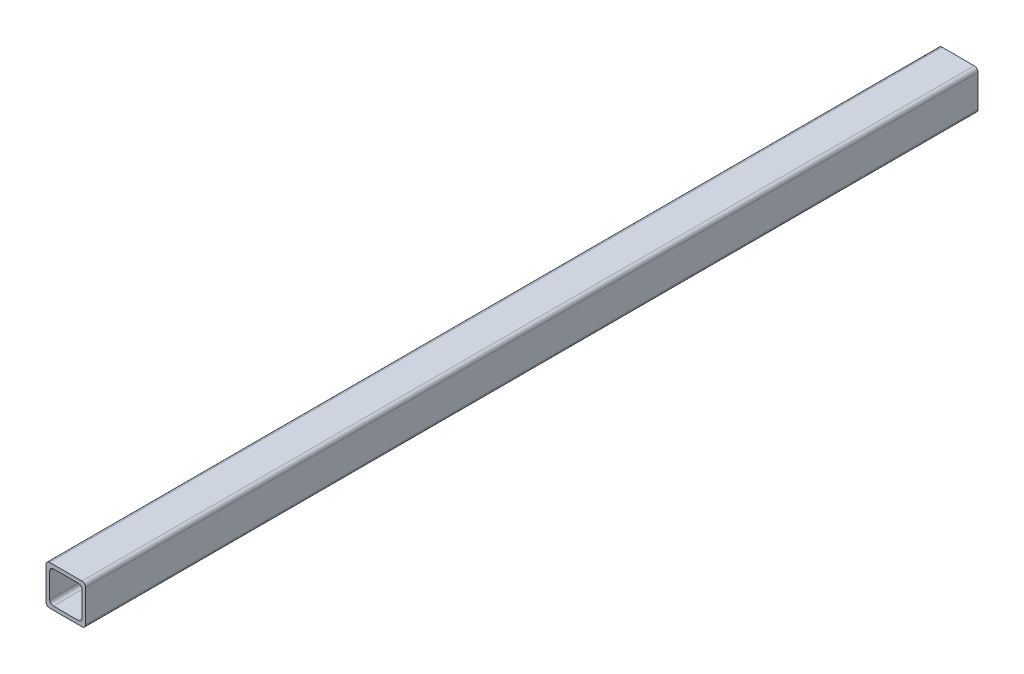
ISO-10303-21;
HEADER;
FILE_DESCRIPTION(('STEP AP214'),'2;1');
FILE_NAME('part.step','',(''),(''),'','','');
FILE_SCHEMA(('AUTOMOTIVE_DESIGN { 1 0 10303 214 1 1 1 1 }'));
ENDSEC;
DATA;
#1=APPLICATION_CONTEXT('core data for automotive mechanical design processes');
#2=APPLICATION_PROTOCOL_DEFINITION('international standard','automotive_design',2000,#1);
#3=PRODUCT_CONTEXT('',#1,'mechanical');
#4=PRODUCT('Part','Part','',(#3));
#5=PRODUCT_RELATED_PRODUCT_CATEGORY('part','',(#4));
#6=PRODUCT_DEFINITION_FORMATION('','',#4);
#7=PRODUCT_DEFINITION_CONTEXT('part definition',#1,'design');
#8=PRODUCT_DEFINITION('design','',#6,#7);
#9=PRODUCT_DEFINITION_SHAPE('','',#8);
#10=(LENGTH_UNIT() NAMED_UNIT(*) SI_UNIT(.MILLI.,.METRE.));
#11=(NAMED_UNIT(*) PLANE_ANGLE_UNIT() SI_UNIT($,.RADIAN.));
#12=(NAMED_UNIT(*) SI_UNIT($,.STERADIAN.) SOLID_ANGLE_UNIT());
#13=UNCERTAINTY_MEASURE_WITH_UNIT(LENGTH_MEASURE(1.E-05),#10,'distance_accuracy_value','');
#14=(GEOMETRIC_REPRESENTATION_CONTEXT(3) GLOBAL_UNCERTAINTY_ASSIGNED_CONTEXT((#13)) GLOBAL_UNIT_ASSIGNED_CONTEXT((#10,
#11,#12)) REPRESENTATION_CONTEXT('',''));
#15=CARTESIAN_POINT('',(0.,0.,0.));
#16=DIRECTION('',(0.,0.,1.));
#17=DIRECTION('',(1.,0.,0.));
#18=AXIS2_PLACEMENT_3D('',#15,#16,#17);
#19=CARTESIAN_POINT('',(11.,11.,609.6));
#20=DIRECTION('',(0.,0.,-1.));
#21=DIRECTION('',(-1.,0.,0.));
#22=AXIS2_PLACEMENT_3D('',#19,#20,#21);
#23=PLANE('',#22);
#24=CARTESIAN_POINT('',(11.,11.,609.6));
#25=DIRECTION('',(0.,0.,1.));
#26=DIRECTION('',(-1.,0.,0.));
#27=AXIS2_PLACEMENT_3D('',#24,#25,#26);
#28=CIRCLE('',#27,2.54);
#29=CARTESIAN_POINT('',(13.54,11.,609.6));
#30=VERTEX_POINT('',#29);
#31=CARTESIAN_POINT('',(11.,13.54,609.6));
#32=VERTEX_POINT('',#31);
#33=EDGE_CURVE('E248',#30,#32,#28,.T.);
#34=ORIENTED_EDGE('',*,*,#33,.T.);
#35=DIRECTION('',(-1.,0.,0.));
#36=VECTOR('',#35,1.);
#37=CARTESIAN_POINT('',(-11.,13.54,609.6));
#38=LINE('',#37,#36);
#39=CARTESIAN_POINT('',(-11.,13.54,609.6));
#40=VERTEX_POINT('',#39);
#41=EDGE_CURVE('E252',#32,#40,#38,.T.);
#42=ORIENTED_EDGE('',*,*,#41,.T.);
#43=CARTESIAN_POINT('',(-11.,11.,609.6));
#44=DIRECTION('',(0.,0.,1.));
#45=DIRECTION('',(-1.,0.,0.));
#46=AXIS2_PLACEMENT_3D('',#43,#44,#45);
#47=CIRCLE('',#46,2.54);
#48=CARTESIAN_POINT('',(-13.54,11.,609.6));
#49=VERTEX_POINT('',#48);
#50=EDGE_CURVE('E256',#40,#49,#47,.T.);
#51=ORIENTED_EDGE('',*,*,#50,.T.);
#52=DIRECTION('',(0.,-1.,0.));
#53=VECTOR('',#52,1.);
#54=CARTESIAN_POINT('',(-13.54,-11.,609.6));
#55=LINE('',#54,#53);
#56=CARTESIAN_POINT('',(-13.54,-11.,609.6));
#57=VERTEX_POINT('',#56);
#58=EDGE_CURVE('E259',#49,#57,#55,.T.);
#59=ORIENTED_EDGE('',*,*,#58,.T.);
#60=CARTESIAN_POINT('',(-11.,-11.,609.6));
#61=DIRECTION('',(0.,0.,1.));
#62=DIRECTION('',(-1.,0.,0.));
#63=AXIS2_PLACEMENT_3D('',#60,#61,#62);
#64=CIRCLE('',#63,2.54);
#65=CARTESIAN_POINT('',(-11.,-13.54,609.6));
#66=VERTEX_POINT('',#65);
#67=EDGE_CURVE('E262',#57,#66,#64,.T.);
#68=ORIENTED_EDGE('',*,*,#67,.T.);
#69=DIRECTION('',(1.,0.,0.));
#70=VECTOR('',#69,1.);
#71=CARTESIAN_POINT('',(-11.,-13.54,609.6));
#72=LINE('',#71,#70);
#73=CARTESIAN_POINT('',(11.,-13.54,609.6));
#74=VERTEX_POINT('',#73);
#75=EDGE_CURVE('E265',#66,#74,#72,.T.);
#76=ORIENTED_EDGE('',*,*,#75,.T.);
#77=CARTESIAN_POINT('',(11.,-11.,609.6));
#78=DIRECTION('',(0.,0.,1.));
#79=DIRECTION('',(1.,0.,0.));
#80=AXIS2_PLACEMENT_3D('',#77,#78,#79);
#81=CIRCLE('',#80,2.54);
#82=CARTESIAN_POINT('',(13.54,-11.,609.6));
#83=VERTEX_POINT('',#82);
#84=EDGE_CURVE('E268',#74,#83,#81,.T.);
#85=ORIENTED_EDGE('',*,*,#84,.T.);
#86=DIRECTION('',(0.,1.,0.));
#87=VECTOR('',#86,1.);
#88=CARTESIAN_POINT('',(13.54,-11.,609.6));
#89=LINE('',#88,#87);
#90=EDGE_CURVE('E271',#83,#30,#89,.T.);
#91=ORIENTED_EDGE('',*,*,#90,.T.);
#92=EDGE_LOOP('',(#34,#42,#51,#59,#68,#76,#85,#91));
#93=FACE_BOUND('',#92,.T.);
#94=CARTESIAN_POINT('',(8.46,-8.46,609.6));
#95=DIRECTION('',(0.,0.,1.));
#96=DIRECTION('',(-1.,0.,0.));
#97=AXIS2_PLACEMENT_3D('',#94,#95,#96);
#98=CIRCLE('',#97,2.54);
#99=CARTESIAN_POINT('',(8.45999999999998,-11.,609.6));
#100=VERTEX_POINT('',#99);
#101=CARTESIAN_POINT('',(11.,-8.45999999999998,609.6));
#102=VERTEX_POINT('',#101);
#103=EDGE_CURVE('E159',#100,#102,#98,.T.);
#104=ORIENTED_EDGE('',*,*,#103,.F.);
#105=DIRECTION('',(1.,0.,0.));
#106=VECTOR('',#105,1.);
#107=CARTESIAN_POINT('',(-8.45999999999998,-11.,609.6));
#108=LINE('',#107,#106);
#109=CARTESIAN_POINT('',(-8.45999999999998,-11.,609.6));
#110=VERTEX_POINT('',#109);
#111=EDGE_CURVE('E200',#110,#100,#108,.T.);
#112=ORIENTED_EDGE('',*,*,#111,.F.);
#113=CARTESIAN_POINT('',(-8.46,-8.46,609.6));
#114=DIRECTION('',(0.,0.,1.));
#115=DIRECTION('',(1.,0.,0.));
#116=AXIS2_PLACEMENT_3D('',#113,#114,#115);
#117=CIRCLE('',#116,2.54);
#118=CARTESIAN_POINT('',(-11.,-8.45999999999998,609.6));
#119=VERTEX_POINT('',#118);
#120=EDGE_CURVE('E197',#119,#110,#117,.T.);
#121=ORIENTED_EDGE('',*,*,#120,.F.);
#122=DIRECTION('',(0.,-1.,0.));
#123=VECTOR('',#122,1.);
#124=CARTESIAN_POINT('',(-11.,-8.45999999999998,609.6));
#125=LINE('',#124,#123);
#126=CARTESIAN_POINT('',(-11.,8.45999999999998,609.6));
#127=VERTEX_POINT('',#126);
#128=EDGE_CURVE('E194',#127,#119,#125,.T.);
#129=ORIENTED_EDGE('',*,*,#128,.F.);
#130=CARTESIAN_POINT('',(-8.46,8.46,609.6));
#131=DIRECTION('',(0.,0.,1.));
#132=DIRECTION('',(-1.,0.,0.));
#133=AXIS2_PLACEMENT_3D('',#130,#131,#132);
#134=CIRCLE('',#133,2.54);
#135=CARTESIAN_POINT('',(-8.45999999999998,11.,609.6));
#136=VERTEX_POINT('',#135);
#137=EDGE_CURVE('E191',#136,#127,#134,.T.);
#138=ORIENTED_EDGE('',*,*,#137,.F.);
#139=DIRECTION('',(-1.,0.,0.));
#140=VECTOR('',#139,1.);
#141=CARTESIAN_POINT('',(-8.45999999999998,11.,609.6));
#142=LINE('',#141,#140);
#143=CARTESIAN_POINT('',(8.45999999999998,11.,609.6));
#144=VERTEX_POINT('',#143);
#145=EDGE_CURVE('E186',#144,#136,#142,.T.);
#146=ORIENTED_EDGE('',*,*,#145,.F.);
#147=CARTESIAN_POINT('',(8.46,8.46,609.6));
#148=DIRECTION('',(0.,0.,1.));
#149=DIRECTION('',(-1.,0.,0.));
#150=AXIS2_PLACEMENT_3D('',#147,#148,#149);
#151=CIRCLE('',#150,2.54);
#152=CARTESIAN_POINT('',(11.,8.45999999999998,609.6));
#153=VERTEX_POINT('',#152);
#154=EDGE_CURVE('E182',#153,#144,#151,.T.);
#155=ORIENTED_EDGE('',*,*,#154,.F.);
#156=DIRECTION('',(0.,1.,0.));
#157=VECTOR('',#156,1.);
#158=CARTESIAN_POINT('',(11.,-8.45999999999998,609.6));
#159=LINE('',#158,#157);
#160=EDGE_CURVE('E168',#102,#153,#159,.T.);
#161=ORIENTED_EDGE('',*,*,#160,.F.);
#162=EDGE_LOOP('',(#104,#112,#121,#129,#138,#146,#155,#161));
#163=FACE_BOUND('',#162,.T.);
#164=ADVANCED_FACE('F45',(#93,#163),#23,.F.);
#165=CARTESIAN_POINT('',(11.,11.,0.));
#166=DIRECTION('',(0.,0.,-1.));
#167=DIRECTION('',(-1.,0.,0.));
#168=AXIS2_PLACEMENT_3D('',#165,#166,#167);
#169=PLANE('',#168);
#170=CARTESIAN_POINT('',(11.,11.,0.));
#171=DIRECTION('',(0.,0.,1.));
#172=DIRECTION('',(-1.,0.,0.));
#173=AXIS2_PLACEMENT_3D('',#170,#171,#172);
#174=CIRCLE('',#173,2.54);
#175=CARTESIAN_POINT('',(13.54,11.,0.));
#176=VERTEX_POINT('',#175);
#177=CARTESIAN_POINT('',(11.,13.54,0.));
#178=VERTEX_POINT('',#177);
#179=EDGE_CURVE('E177',#176,#178,#174,.T.);
#180=ORIENTED_EDGE('',*,*,#179,.F.);
#181=DIRECTION('',(0.,1.,0.));
#182=VECTOR('',#181,1.);
#183=CARTESIAN_POINT('',(13.54,-11.,0.));
#184=LINE('',#183,#182);
#185=CARTESIAN_POINT('',(13.54,-11.,0.));
#186=VERTEX_POINT('',#185);
#187=EDGE_CURVE('E253',#186,#176,#184,.T.);
#188=ORIENTED_EDGE('',*,*,#187,.F.);
#189=CARTESIAN_POINT('',(11.,-11.,0.));
#190=DIRECTION('',(0.,0.,1.));
#191=DIRECTION('',(1.,0.,0.));
#192=AXIS2_PLACEMENT_3D('',#189,#190,#191);
#193=CIRCLE('',#192,2.54);
#194=CARTESIAN_POINT('',(11.,-13.54,0.));
#195=VERTEX_POINT('',#194);
#196=EDGE_CURVE('E293',#195,#186,#193,.T.);
#197=ORIENTED_EDGE('',*,*,#196,.F.);
#198=DIRECTION('',(1.,0.,0.));
#199=VECTOR('',#198,1.);
#200=CARTESIAN_POINT('',(-11.,-13.54,0.));
#201=LINE('',#200,#199);
#202=CARTESIAN_POINT('',(-11.,-13.54,0.));
#203=VERTEX_POINT('',#202);
#204=EDGE_CURVE('E290',#203,#195,#201,.T.);
#205=ORIENTED_EDGE('',*,*,#204,.F.);
#206=CARTESIAN_POINT('',(-11.,-11.,0.));
#207=DIRECTION('',(0.,0.,1.));
#208=DIRECTION('',(-1.,0.,0.));
#209=AXIS2_PLACEMENT_3D('',#206,#207,#208);
#210=CIRCLE('',#209,2.54);
#211=CARTESIAN_POINT('',(-13.54,-11.,0.));
#212=VERTEX_POINT('',#211);
#213=EDGE_CURVE('E287',#212,#203,#210,.T.);
#214=ORIENTED_EDGE('',*,*,#213,.F.);
#215=DIRECTION('',(0.,-1.,0.));
#216=VECTOR('',#215,1.);
#217=CARTESIAN_POINT('',(-13.54,-11.,0.));
#218=LINE('',#217,#216);
#219=CARTESIAN_POINT('',(-13.54,11.,0.));
#220=VERTEX_POINT('',#219);
#221=EDGE_CURVE('E284',#220,#212,#218,.T.);
#222=ORIENTED_EDGE('',*,*,#221,.F.);
#223=CARTESIAN_POINT('',(-11.,11.,0.));
#224=DIRECTION('',(0.,0.,1.));
#225=DIRECTION('',(-1.,0.,0.));
#226=AXIS2_PLACEMENT_3D('',#223,#224,#225);
#227=CIRCLE('',#226,2.54);
#228=CARTESIAN_POINT('',(-11.,13.54,0.));
#229=VERTEX_POINT('',#228);
#230=EDGE_CURVE('E281',#229,#220,#227,.T.);
#231=ORIENTED_EDGE('',*,*,#230,.F.);
#232=DIRECTION('',(-1.,0.,0.));
#233=VECTOR('',#232,1.);
#234=CARTESIAN_POINT('',(-11.,13.54,0.));
#235=LINE('',#234,#233);
#236=EDGE_CURVE('E278',#178,#229,#235,.T.);
#237=ORIENTED_EDGE('',*,*,#236,.F.);
#238=EDGE_LOOP('',(#180,#188,#197,#205,#214,#222,#231,#237));
#239=FACE_BOUND('',#238,.T.);
#240=DIRECTION('',(1.,0.,0.));
#241=VECTOR('',#240,1.);
#242=CARTESIAN_POINT('',(-8.45999999999998,-11.,0.));
#243=LINE('',#242,#241);
#244=CARTESIAN_POINT('',(-8.45999999999998,-11.,0.));
#245=VERTEX_POINT('',#244);
#246=CARTESIAN_POINT('',(8.45999999999998,-11.,0.));
#247=VERTEX_POINT('',#246);
#248=EDGE_CURVE('E169',#245,#247,#243,.T.);
#249=ORIENTED_EDGE('',*,*,#248,.T.);
#250=CARTESIAN_POINT('',(8.46,-8.46,0.));
#251=DIRECTION('',(0.,0.,1.));
#252=DIRECTION('',(-1.,0.,0.));
#253=AXIS2_PLACEMENT_3D('',#250,#251,#252);
#254=CIRCLE('',#253,2.54);
#255=CARTESIAN_POINT('',(11.,-8.45999999999998,0.));
#256=VERTEX_POINT('',#255);
#257=EDGE_CURVE('E69',#247,#256,#254,.T.);
#258=ORIENTED_EDGE('',*,*,#257,.T.);
#259=DIRECTION('',(0.,1.,0.));
#260=VECTOR('',#259,1.);
#261=CARTESIAN_POINT('',(11.,-8.45999999999998,0.));
#262=LINE('',#261,#260);
#263=CARTESIAN_POINT('',(11.,8.45999999999998,0.));
#264=VERTEX_POINT('',#263);
#265=EDGE_CURVE('E175',#256,#264,#262,.T.);
#266=ORIENTED_EDGE('',*,*,#265,.T.);
#267=CARTESIAN_POINT('',(8.46,8.46,0.));
#268=DIRECTION('',(0.,0.,1.));
#269=DIRECTION('',(-1.,0.,0.));
#270=AXIS2_PLACEMENT_3D('',#267,#268,#269);
#271=CIRCLE('',#270,2.54);
#272=CARTESIAN_POINT('',(8.45999999999998,11.,0.));
#273=VERTEX_POINT('',#272);
#274=EDGE_CURVE('E207',#264,#273,#271,.T.);
#275=ORIENTED_EDGE('',*,*,#274,.T.);
#276=DIRECTION('',(-1.,0.,0.));
#277=VECTOR('',#276,1.);
#278=CARTESIAN_POINT('',(-8.45999999999998,11.,0.));
#279=LINE('',#278,#277);
#280=CARTESIAN_POINT('',(-8.45999999999998,11.,0.));
#281=VERTEX_POINT('',#280);
#282=EDGE_CURVE('E211',#273,#281,#279,.T.);
#283=ORIENTED_EDGE('',*,*,#282,.T.);
#284=CARTESIAN_POINT('',(-8.46,8.46,0.));
#285=DIRECTION('',(0.,0.,1.));
#286=DIRECTION('',(-1.,0.,0.));
#287=AXIS2_PLACEMENT_3D('',#284,#285,#286);
#288=CIRCLE('',#287,2.54);
#289=CARTESIAN_POINT('',(-11.,8.45999999999998,0.));
#290=VERTEX_POINT('',#289);
#291=EDGE_CURVE('E215',#281,#290,#288,.T.);
#292=ORIENTED_EDGE('',*,*,#291,.T.);
#293=DIRECTION('',(0.,-1.,0.));
#294=VECTOR('',#293,1.);
#295=CARTESIAN_POINT('',(-11.,-8.45999999999998,0.));
#296=LINE('',#295,#294);
#297=CARTESIAN_POINT('',(-11.,-8.45999999999998,0.));
#298=VERTEX_POINT('',#297);
#299=EDGE_CURVE('E219',#290,#298,#296,.T.);
#300=ORIENTED_EDGE('',*,*,#299,.T.);
#301=CARTESIAN_POINT('',(-8.46,-8.46,0.));
#302=DIRECTION('',(0.,0.,1.));
#303=DIRECTION('',(1.,0.,0.));
#304=AXIS2_PLACEMENT_3D('',#301,#302,#303);
#305=CIRCLE('',#304,2.54);
#306=EDGE_CURVE('E223',#298,#245,#305,.T.);
#307=ORIENTED_EDGE('',*,*,#306,.T.);
#308=EDGE_LOOP('',(#249,#258,#266,#275,#283,#292,#300,#307));
#309=FACE_BOUND('',#308,.T.);
#310=ADVANCED_FACE('F332',(#239,#309),#169,.T.);
#311=CARTESIAN_POINT('',(11.,11.,609.6));
#312=DIRECTION('',(0.,0.,-1.));
#313=DIRECTION('',(-1.,0.,0.));
#314=AXIS2_PLACEMENT_3D('',#311,#312,#313);
#315=CYLINDRICAL_SURFACE('',#314,2.54);
#316=ORIENTED_EDGE('',*,*,#179,.T.);
#317=DIRECTION('',(0.,0.,-1.));
#318=VECTOR('',#317,1.);
#319=CARTESIAN_POINT('',(11.,13.54,609.6));
#320=LINE('',#319,#318);
#321=EDGE_CURVE('E11',#32,#178,#320,.T.);
#322=ORIENTED_EDGE('',*,*,#321,.F.);
#323=ORIENTED_EDGE('',*,*,#33,.F.);
#324=DIRECTION('',(0.,0.,-1.));
#325=VECTOR('',#324,1.);
#326=CARTESIAN_POINT('',(13.54,11.,609.6));
#327=LINE('',#326,#325);
#328=EDGE_CURVE('E274',#30,#176,#327,.T.);
#329=ORIENTED_EDGE('',*,*,#328,.T.);
#330=EDGE_LOOP('',(#316,#322,#323,#329));
#331=FACE_BOUND('',#330,.T.);
#332=ADVANCED_FACE('F47',(#331),#315,.T.);
#333=CARTESIAN_POINT('',(-11.,13.54,609.6));
#334=DIRECTION('',(0.,-1.,0.));
#335=DIRECTION('',(0.,0.,-1.));
#336=AXIS2_PLACEMENT_3D('',#333,#334,#335);
#337=PLANE('',#336);
#338=ORIENTED_EDGE('',*,*,#236,.T.);
#339=DIRECTION('',(0.,0.,-1.));
#340=VECTOR('',#339,1.);
#341=CARTESIAN_POINT('',(-11.,13.54,609.6));
#342=LINE('',#341,#340);
#343=EDGE_CURVE('E54',#40,#229,#342,.T.);
#344=ORIENTED_EDGE('',*,*,#343,.F.);
#345=ORIENTED_EDGE('',*,*,#41,.F.);
#346=ORIENTED_EDGE('',*,*,#321,.T.);
#347=EDGE_LOOP('',(#338,#344,#345,#346));
#348=FACE_BOUND('',#347,.T.);
#349=ADVANCED_FACE('F349',(#348),#337,.F.);
#350=CARTESIAN_POINT('',(-11.,11.,609.6));
#351=DIRECTION('',(0.,0.,-1.));
#352=DIRECTION('',(-1.,0.,0.));
#353=AXIS2_PLACEMENT_3D('',#350,#351,#352);
#354=CYLINDRICAL_SURFACE('',#353,2.54);
#355=ORIENTED_EDGE('',*,*,#230,.T.);
#356=DIRECTION('',(0.,0.,-1.));
#357=VECTOR('',#356,1.);
#358=CARTESIAN_POINT('',(-13.54,11.,609.6));
#359=LINE('',#358,#357);
#360=EDGE_CURVE('E317',#49,#220,#359,.T.);
#361=ORIENTED_EDGE('',*,*,#360,.F.);
#362=ORIENTED_EDGE('',*,*,#50,.F.);
#363=ORIENTED_EDGE('',*,*,#343,.T.);
#364=EDGE_LOOP('',(#355,#361,#362,#363));
#365=FACE_BOUND('',#364,.T.);
#366=ADVANCED_FACE('F326',(#365),#354,.T.);
#367=CARTESIAN_POINT('',(-13.54,-11.,609.6));
#368=DIRECTION('',(1.,0.,0.));
#369=DIRECTION('',(0.,0.,-1.));
#370=AXIS2_PLACEMENT_3D('',#367,#368,#369);
#371=PLANE('',#370);
#372=ORIENTED_EDGE('',*,*,#221,.T.);
#373=DIRECTION('',(0.,0.,-1.));
#374=VECTOR('',#373,1.);
#375=CARTESIAN_POINT('',(-13.54,-11.,609.6));
#376=LINE('',#375,#374);
#377=EDGE_CURVE('E313',#57,#212,#376,.T.);
#378=ORIENTED_EDGE('',*,*,#377,.F.);
#379=ORIENTED_EDGE('',*,*,#58,.F.);
#380=ORIENTED_EDGE('',*,*,#360,.T.);
#381=EDGE_LOOP('',(#372,#378,#379,#380));
#382=FACE_BOUND('',#381,.T.);
#383=ADVANCED_FACE('F338',(#382),#371,.F.);
#384=CARTESIAN_POINT('',(-11.,-11.,609.6));
#385=DIRECTION('',(0.,0.,-1.));
#386=DIRECTION('',(-1.,0.,0.));
#387=AXIS2_PLACEMENT_3D('',#384,#385,#386);
#388=CYLINDRICAL_SURFACE('',#387,2.54);
#389=ORIENTED_EDGE('',*,*,#213,.T.);
#390=DIRECTION('',(0.,0.,-1.));
#391=VECTOR('',#390,1.);
#392=CARTESIAN_POINT('',(-11.,-13.54,609.6));
#393=LINE('',#392,#391);
#394=EDGE_CURVE('E309',#66,#203,#393,.T.);
#395=ORIENTED_EDGE('',*,*,#394,.F.);
#396=ORIENTED_EDGE('',*,*,#67,.F.);
#397=ORIENTED_EDGE('',*,*,#377,.T.);
#398=EDGE_LOOP('',(#389,#395,#396,#397));
#399=FACE_BOUND('',#398,.T.);
#400=ADVANCED_FACE('F342',(#399),#388,.T.);
#401=CARTESIAN_POINT('',(-11.,-13.54,609.6));
#402=DIRECTION('',(0.,1.,0.));
#403=DIRECTION('',(0.,0.,1.));
#404=AXIS2_PLACEMENT_3D('',#401,#402,#403);
#405=PLANE('',#404);
#406=ORIENTED_EDGE('',*,*,#204,.T.);
#407=DIRECTION('',(0.,0.,-1.));
#408=VECTOR('',#407,1.);
#409=CARTESIAN_POINT('',(11.,-13.54,609.6));
#410=LINE('',#409,#408);
#411=EDGE_CURVE('E305',#74,#195,#410,.T.);
#412=ORIENTED_EDGE('',*,*,#411,.F.);
#413=ORIENTED_EDGE('',*,*,#75,.F.);
#414=ORIENTED_EDGE('',*,*,#394,.T.);
#415=EDGE_LOOP('',(#406,#412,#413,#414));
#416=FACE_BOUND('',#415,.T.);
#417=ADVANCED_FACE('F362',(#416),#405,.F.);
#418=CARTESIAN_POINT('',(11.,-11.,609.6));
#419=DIRECTION('',(0.,0.,-1.));
#420=DIRECTION('',(-1.,0.,0.));
#421=AXIS2_PLACEMENT_3D('',#418,#419,#420);
#422=CYLINDRICAL_SURFACE('',#421,2.54);
#423=ORIENTED_EDGE('',*,*,#196,.T.);
#424=DIRECTION('',(0.,0.,-1.));
#425=VECTOR('',#424,1.);
#426=CARTESIAN_POINT('',(13.54,-11.,609.6));
#427=LINE('',#426,#425);
#428=EDGE_CURVE('E301',#83,#186,#427,.T.);
#429=ORIENTED_EDGE('',*,*,#428,.F.);
#430=ORIENTED_EDGE('',*,*,#84,.F.);
#431=ORIENTED_EDGE('',*,*,#411,.T.);
#432=EDGE_LOOP('',(#423,#429,#430,#431));
#433=FACE_BOUND('',#432,.T.);
#434=ADVANCED_FACE('F360',(#433),#422,.T.);
#435=CARTESIAN_POINT('',(13.54,-11.,609.6));
#436=DIRECTION('',(-1.,0.,0.));
#437=DIRECTION('',(0.,0.,1.));
#438=AXIS2_PLACEMENT_3D('',#435,#436,#437);
#439=PLANE('',#438);
#440=ORIENTED_EDGE('',*,*,#187,.T.);
#441=ORIENTED_EDGE('',*,*,#328,.F.);
#442=ORIENTED_EDGE('',*,*,#90,.F.);
#443=ORIENTED_EDGE('',*,*,#428,.T.);
#444=EDGE_LOOP('',(#440,#441,#442,#443));
#445=FACE_BOUND('',#444,.T.);
#446=ADVANCED_FACE('F355',(#445),#439,.F.);
#447=CARTESIAN_POINT('',(8.46,-8.46,609.6));
#448=DIRECTION('',(0.,0.,-1.));
#449=DIRECTION('',(-1.,0.,0.));
#450=AXIS2_PLACEMENT_3D('',#447,#448,#449);
#451=CYLINDRICAL_SURFACE('',#450,2.54);
#452=ORIENTED_EDGE('',*,*,#257,.F.);
#453=DIRECTION('',(0.,0.,-1.));
#454=VECTOR('',#453,1.);
#455=CARTESIAN_POINT('',(8.45999999999998,-11.,609.6));
#456=LINE('',#455,#454);
#457=EDGE_CURVE('E163',#100,#247,#456,.T.);
#458=ORIENTED_EDGE('',*,*,#457,.F.);
#459=ORIENTED_EDGE('',*,*,#103,.T.);
#460=DIRECTION('',(0.,0.,-1.));
#461=VECTOR('',#460,1.);
#462=CARTESIAN_POINT('',(11.,-8.45999999999998,609.6));
#463=LINE('',#462,#461);
#464=EDGE_CURVE('E162',#102,#256,#463,.T.);
#465=ORIENTED_EDGE('',*,*,#464,.T.);
#466=EDGE_LOOP('',(#452,#458,#459,#465));
#467=FACE_BOUND('',#466,.T.);
#468=ADVANCED_FACE('F161',(#467),#451,.F.);
#469=CARTESIAN_POINT('',(11.,-8.45999999999998,609.6));
#470=DIRECTION('',(-1.,0.,0.));
#471=DIRECTION('',(0.,0.,1.));
#472=AXIS2_PLACEMENT_3D('',#469,#470,#471);
#473=PLANE('',#472);
#474=ORIENTED_EDGE('',*,*,#265,.F.);
#475=ORIENTED_EDGE('',*,*,#464,.F.);
#476=ORIENTED_EDGE('',*,*,#160,.T.);
#477=DIRECTION('',(0.,0.,-1.));
#478=VECTOR('',#477,1.);
#479=CARTESIAN_POINT('',(11.,8.45999999999998,609.6));
#480=LINE('',#479,#478);
#481=EDGE_CURVE('E178',#153,#264,#480,.T.);
#482=ORIENTED_EDGE('',*,*,#481,.T.);
#483=EDGE_LOOP('',(#474,#475,#476,#482));
#484=FACE_BOUND('',#483,.T.);
#485=ADVANCED_FACE('F172',(#484),#473,.T.);
#486=CARTESIAN_POINT('',(8.46,8.46,609.6));
#487=DIRECTION('',(0.,0.,-1.));
#488=DIRECTION('',(-1.,0.,0.));
#489=AXIS2_PLACEMENT_3D('',#486,#487,#488);
#490=CYLINDRICAL_SURFACE('',#489,2.54);
#491=ORIENTED_EDGE('',*,*,#274,.F.);
#492=ORIENTED_EDGE('',*,*,#481,.F.);
#493=ORIENTED_EDGE('',*,*,#154,.T.);
#494=DIRECTION('',(0.,0.,-1.));
#495=VECTOR('',#494,1.);
#496=CARTESIAN_POINT('',(8.45999999999998,11.,609.6));
#497=LINE('',#496,#495);
#498=EDGE_CURVE('E243',#144,#273,#497,.T.);
#499=ORIENTED_EDGE('',*,*,#498,.T.);
#500=EDGE_LOOP('',(#491,#492,#493,#499));
#501=FACE_BOUND('',#500,.T.);
#502=ADVANCED_FACE('F387',(#501),#490,.F.);
#503=CARTESIAN_POINT('',(-8.45999999999998,11.,609.6));
#504=DIRECTION('',(0.,-1.,0.));
#505=DIRECTION('',(0.,0.,-1.));
#506=AXIS2_PLACEMENT_3D('',#503,#504,#505);
#507=PLANE('',#506);
#508=ORIENTED_EDGE('',*,*,#282,.F.);
#509=ORIENTED_EDGE('',*,*,#498,.F.);
#510=ORIENTED_EDGE('',*,*,#145,.T.);
#511=DIRECTION('',(0.,0.,-1.));
#512=VECTOR('',#511,1.);
#513=CARTESIAN_POINT('',(-8.45999999999998,11.,609.6));
#514=LINE('',#513,#512);
#515=EDGE_CURVE('E240',#136,#281,#514,.T.);
#516=ORIENTED_EDGE('',*,*,#515,.T.);
#517=EDGE_LOOP('',(#508,#509,#510,#516));
#518=FACE_BOUND('',#517,.T.);
#519=ADVANCED_FACE('F391',(#518),#507,.T.);
#520=CARTESIAN_POINT('',(-8.46,8.46,609.6));
#521=DIRECTION('',(0.,0.,-1.));
#522=DIRECTION('',(-1.,0.,0.));
#523=AXIS2_PLACEMENT_3D('',#520,#521,#522);
#524=CYLINDRICAL_SURFACE('',#523,2.54);
#525=ORIENTED_EDGE('',*,*,#291,.F.);
#526=ORIENTED_EDGE('',*,*,#515,.F.);
#527=ORIENTED_EDGE('',*,*,#137,.T.);
#528=DIRECTION('',(0.,0.,-1.));
#529=VECTOR('',#528,1.);
#530=CARTESIAN_POINT('',(-11.,8.45999999999998,609.6));
#531=LINE('',#530,#529);
#532=EDGE_CURVE('E237',#127,#290,#531,.T.);
#533=ORIENTED_EDGE('',*,*,#532,.T.);
#534=EDGE_LOOP('',(#525,#526,#527,#533));
#535=FACE_BOUND('',#534,.T.);
#536=ADVANCED_FACE('F397',(#535),#524,.F.);
#537=CARTESIAN_POINT('',(-11.,-8.45999999999998,609.6));
#538=DIRECTION('',(1.,0.,0.));
#539=DIRECTION('',(0.,0.,-1.));
#540=AXIS2_PLACEMENT_3D('',#537,#538,#539);
#541=PLANE('',#540);
#542=ORIENTED_EDGE('',*,*,#299,.F.);
#543=ORIENTED_EDGE('',*,*,#532,.F.);
#544=ORIENTED_EDGE('',*,*,#128,.T.);
#545=DIRECTION('',(0.,0.,-1.));
#546=VECTOR('',#545,1.);
#547=CARTESIAN_POINT('',(-11.,-8.45999999999998,609.6));
#548=LINE('',#547,#546);
#549=EDGE_CURVE('E234',#119,#298,#548,.T.);
#550=ORIENTED_EDGE('',*,*,#549,.T.);
#551=EDGE_LOOP('',(#542,#543,#544,#550));
#552=FACE_BOUND('',#551,.T.);
#553=ADVANCED_FACE('F401',(#552),#541,.T.);
#554=CARTESIAN_POINT('',(-8.46,-8.46,609.6));
#555=DIRECTION('',(0.,0.,-1.));
#556=DIRECTION('',(-1.,0.,0.));
#557=AXIS2_PLACEMENT_3D('',#554,#555,#556);
#558=CYLINDRICAL_SURFACE('',#557,2.54);
#559=ORIENTED_EDGE('',*,*,#306,.F.);
#560=ORIENTED_EDGE('',*,*,#549,.F.);
#561=ORIENTED_EDGE('',*,*,#120,.T.);
#562=DIRECTION('',(0.,0.,-1.));
#563=VECTOR('',#562,1.);
#564=CARTESIAN_POINT('',(-8.45999999999998,-11.,609.6));
#565=LINE('',#564,#563);
#566=EDGE_CURVE('E61',#110,#245,#565,.T.);
#567=ORIENTED_EDGE('',*,*,#566,.T.);
#568=EDGE_LOOP('',(#559,#560,#561,#567));
#569=FACE_BOUND('',#568,.T.);
#570=ADVANCED_FACE('F405',(#569),#558,.F.);
#571=CARTESIAN_POINT('',(-8.45999999999998,-11.,609.6));
#572=DIRECTION('',(0.,1.,0.));
#573=DIRECTION('',(0.,0.,1.));
#574=AXIS2_PLACEMENT_3D('',#571,#572,#573);
#575=PLANE('',#574);
#576=ORIENTED_EDGE('',*,*,#248,.F.);
#577=ORIENTED_EDGE('',*,*,#566,.F.);
#578=ORIENTED_EDGE('',*,*,#111,.T.);
#579=ORIENTED_EDGE('',*,*,#457,.T.);
#580=EDGE_LOOP('',(#576,#577,#578,#579));
#581=FACE_BOUND('',#580,.T.);
#582=ADVANCED_FACE('F409',(#581),#575,.T.);
#583=CLOSED_SHELL('',(#164,#310,#332,#349,#366,#383,#400,#417,#434,#446,#468,#485,#502,#519,
#536,#553,#570,#582));
#584=MANIFOLD_SOLID_BREP('B2',#583);
#585=ADVANCED_BREP_SHAPE_REPRESENTATION('',(#18,#584),#14);
#586=SHAPE_DEFINITION_REPRESENTATION(#9,#585);
ENDSEC;
END-ISO-10303-21;
